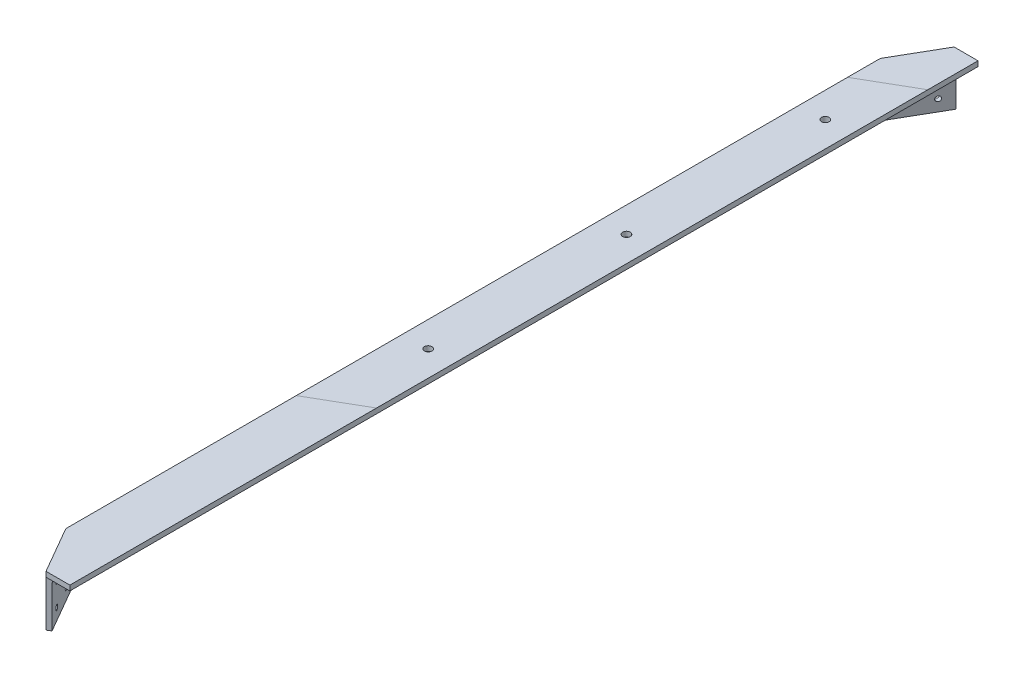
ISO-10303-21;
HEADER;
FILE_DESCRIPTION(('STEP AP214'),'2;1');
FILE_NAME('part.step','',(''),(''),'','','');
FILE_SCHEMA(('AUTOMOTIVE_DESIGN { 1 0 10303 214 1 1 1 1 }'));
ENDSEC;
DATA;
#1=APPLICATION_CONTEXT('core data for automotive mechanical design processes');
#2=APPLICATION_PROTOCOL_DEFINITION('international standard','automotive_design',2000,#1);
#3=PRODUCT_CONTEXT('',#1,'mechanical');
#4=PRODUCT('Part','Part','',(#3));
#5=PRODUCT_RELATED_PRODUCT_CATEGORY('part','',(#4));
#6=PRODUCT_DEFINITION_FORMATION('','',#4);
#7=PRODUCT_DEFINITION_CONTEXT('part definition',#1,'design');
#8=PRODUCT_DEFINITION('design','',#6,#7);
#9=PRODUCT_DEFINITION_SHAPE('','',#8);
#10=(LENGTH_UNIT() NAMED_UNIT(*) SI_UNIT(.MILLI.,.METRE.));
#11=(NAMED_UNIT(*) PLANE_ANGLE_UNIT() SI_UNIT($,.RADIAN.));
#12=(NAMED_UNIT(*) SI_UNIT($,.STERADIAN.) SOLID_ANGLE_UNIT());
#13=UNCERTAINTY_MEASURE_WITH_UNIT(LENGTH_MEASURE(1.E-05),#10,'distance_accuracy_value','');
#14=(GEOMETRIC_REPRESENTATION_CONTEXT(3) GLOBAL_UNCERTAINTY_ASSIGNED_CONTEXT((#13)) GLOBAL_UNIT_ASSIGNED_CONTEXT((#10,
#11,#12)) REPRESENTATION_CONTEXT('',''));
#15=CARTESIAN_POINT('',(0.,0.,0.));
#16=DIRECTION('',(0.,0.,1.));
#17=DIRECTION('',(1.,0.,0.));
#18=AXIS2_PLACEMENT_3D('',#15,#16,#17);
#19=CARTESIAN_POINT('',(-7.99999999999999,8.00000000000001,640.));
#20=DIRECTION('',(0.,-1.,0.));
#21=DIRECTION('',(1.,0.,0.));
#22=AXIS2_PLACEMENT_3D('',#19,#20,#21);
#23=PLANE('',#22);
#24=DIRECTION('',(0.866025403784436,0.,-0.500000000000004));
#25=VECTOR('',#24,1.);
#26=CARTESIAN_POINT('',(-164.815471676956,8.,368.387635642638));
#27=LINE('',#26,#25);
#28=CARTESIAN_POINT('',(-7.99999999999999,8.00000000000001,277.850180856848));
#29=VERTEX_POINT('',#28);
#30=CARTESIAN_POINT('',(72.,8.00000000000001,231.662159321678));
#31=VERTEX_POINT('',#30);
#32=EDGE_CURVE('E11',#29,#31,#27,.T.);
#33=ORIENTED_EDGE('',*,*,#32,.F.);
#34=DIRECTION('',(0.,0.,-1.));
#35=VECTOR('',#34,1.);
#36=CARTESIAN_POINT('',(-7.99999999999999,8.00000000000001,640.));
#37=LINE('',#36,#35);
#38=CARTESIAN_POINT('',(-7.99999999999999,8.00000000000001,637.320508075689));
#39=VERTEX_POINT('',#38);
#40=EDGE_CURVE('E288',#39,#29,#37,.T.);
#41=ORIENTED_EDGE('',*,*,#40,.F.);
#42=CARTESIAN_POINT('',(2.00000000000001,8.00000000000001,637.320508075689));
#43=DIRECTION('',(0.,-1.,0.));
#44=DIRECTION('',(1.,0.,0.));
#45=AXIS2_PLACEMENT_3D('',#42,#43,#44);
#46=CIRCLE('',#45,10.);
#47=CARTESIAN_POINT('',(-6.66025403784442,8.,642.320508075689));
#48=VERTEX_POINT('',#47);
#49=EDGE_CURVE('E311',#39,#48,#46,.F.);
#50=ORIENTED_EDGE('',*,*,#49,.T.);
#51=DIRECTION('',(0.499999999999995,0.,0.866025403784441));
#52=VECTOR('',#51,1.);
#53=CARTESIAN_POINT('',(-7.99999999999999,8.,640.));
#54=LINE('',#53,#52);
#55=CARTESIAN_POINT('',(34.4999999999996,8.,713.612159321677));
#56=VERTEX_POINT('',#55);
#57=EDGE_CURVE('E274',#48,#56,#54,.T.);
#58=ORIENTED_EDGE('',*,*,#57,.T.);
#59=DIRECTION('',(1.,0.,0.));
#60=VECTOR('',#59,1.);
#61=CARTESIAN_POINT('',(34.4999999999996,8.,713.612159321677));
#62=LINE('',#61,#60);
#63=CARTESIAN_POINT('',(72.,8.,713.612159321677));
#64=VERTEX_POINT('',#63);
#65=EDGE_CURVE('E276',#56,#64,#62,.T.);
#66=ORIENTED_EDGE('',*,*,#65,.T.);
#67=DIRECTION('',(0.,0.,-1.));
#68=VECTOR('',#67,1.);
#69=CARTESIAN_POINT('',(72.,8.00000000000001,640.));
#70=LINE('',#69,#68);
#71=EDGE_CURVE('E293',#64,#31,#70,.T.);
#72=ORIENTED_EDGE('',*,*,#71,.T.);
#73=EDGE_LOOP('',(#33,#41,#50,#58,#66,#72));
#74=FACE_BOUND('',#73,.T.);
#75=ADVANCED_FACE('F45',(#74),#23,.F.);
#76=DIRECTION('',(-0.86602540378444,0.,0.499999999999998));
#77=VECTOR('',#76,1.);
#78=CARTESIAN_POINT('',(-539.986635166949,7.99999999999998,-281.427881056769));
#79=LINE('',#78,#77);
#80=CARTESIAN_POINT('',(72.,8.00000000000001,-634.758529610858));
#81=VERTEX_POINT('',#80);
#82=CARTESIAN_POINT('',(-8.00000000000006,8.00000000000001,-588.570508075688));
#83=VERTEX_POINT('',#82);
#84=EDGE_CURVE('E54',#81,#83,#79,.T.);
#85=ORIENTED_EDGE('',*,*,#84,.F.);
#86=CARTESIAN_POINT('',(72.,8.,-713.612159321677));
#87=VERTEX_POINT('',#86);
#88=EDGE_CURVE('E291',#81,#87,#70,.T.);
#89=ORIENTED_EDGE('',*,*,#88,.T.);
#90=DIRECTION('',(1.,0.,0.));
#91=VECTOR('',#90,1.);
#92=CARTESIAN_POINT('',(34.4999999999996,8.,-713.612159321677));
#93=LINE('',#92,#91);
#94=CARTESIAN_POINT('',(34.4999999999996,8.,-713.612159321677));
#95=VERTEX_POINT('',#94);
#96=EDGE_CURVE('E221',#95,#87,#93,.T.);
#97=ORIENTED_EDGE('',*,*,#96,.F.);
#98=DIRECTION('',(0.499999999999995,0.,-0.866025403784441));
#99=VECTOR('',#98,1.);
#100=CARTESIAN_POINT('',(-7.99999999999999,8.,-640.));
#101=LINE('',#100,#99);
#102=CARTESIAN_POINT('',(-6.66025403784448,8.,-642.320508075689));
#103=VERTEX_POINT('',#102);
#104=EDGE_CURVE('E224',#103,#95,#101,.T.);
#105=ORIENTED_EDGE('',*,*,#104,.F.);
#106=CARTESIAN_POINT('',(2.00000000000001,8.00000000000001,-637.320508075689));
#107=DIRECTION('',(0.,-1.,0.));
#108=DIRECTION('',(1.,0.,0.));
#109=AXIS2_PLACEMENT_3D('',#106,#107,#108);
#110=CIRCLE('',#109,10.);
#111=CARTESIAN_POINT('',(-7.99999999999999,8.00000000000001,-637.320508075689));
#112=VERTEX_POINT('',#111);
#113=EDGE_CURVE('E348',#103,#112,#110,.F.);
#114=ORIENTED_EDGE('',*,*,#113,.T.);
#115=EDGE_CURVE('E287',#83,#112,#37,.T.);
#116=ORIENTED_EDGE('',*,*,#115,.F.);
#117=EDGE_LOOP('',(#85,#89,#97,#105,#114,#116));
#118=FACE_BOUND('',#117,.T.);
#119=ADVANCED_FACE('F386',(#118),#23,.F.);
#120=CARTESIAN_POINT('',(72.,0.,640.));
#121=DIRECTION('',(0.,1.,0.));
#122=DIRECTION('',(-1.,0.,0.));
#123=AXIS2_PLACEMENT_3D('',#120,#121,#122);
#124=PLANE('',#123);
#125=CARTESIAN_POINT('',(32.,0.,-513.612159321678));
#126=DIRECTION('',(0.,1.,0.));
#127=DIRECTION('',(-1.,0.,0.));
#128=AXIS2_PLACEMENT_3D('',#125,#126,#127);
#129=CIRCLE('',#128,6.);
#130=CARTESIAN_POINT('',(26.,0.,-513.612159321678));
#131=VERTEX_POINT('',#130);
#132=EDGE_CURVE('E378',#131,#131,#129,.T.);
#133=ORIENTED_EDGE('',*,*,#132,.T.);
#134=EDGE_LOOP('',(#133));
#135=FACE_BOUND('',#134,.T.);
#136=CARTESIAN_POINT('',(32.,0.,-201.112159321678));
#137=DIRECTION('',(0.,1.,0.));
#138=DIRECTION('',(-1.,0.,0.));
#139=AXIS2_PLACEMENT_3D('',#136,#137,#138);
#140=CIRCLE('',#139,6.);
#141=CARTESIAN_POINT('',(26.,0.,-201.112159321678));
#142=VERTEX_POINT('',#141);
#143=EDGE_CURVE('E509',#142,#142,#140,.T.);
#144=ORIENTED_EDGE('',*,*,#143,.T.);
#145=EDGE_LOOP('',(#144));
#146=FACE_BOUND('',#145,.T.);
#147=CARTESIAN_POINT('',(32.,0.,110.512159321678));
#148=DIRECTION('',(0.,1.,0.));
#149=DIRECTION('',(-1.,0.,0.));
#150=AXIS2_PLACEMENT_3D('',#147,#148,#149);
#151=CIRCLE('',#150,6.);
#152=CARTESIAN_POINT('',(26.,0.,110.512159321678));
#153=VERTEX_POINT('',#152);
#154=EDGE_CURVE('E510',#153,#153,#151,.T.);
#155=ORIENTED_EDGE('',*,*,#154,.T.);
#156=EDGE_LOOP('',(#155));
#157=FACE_BOUND('',#156,.T.);
#158=DIRECTION('',(0.,0.,-1.));
#159=VECTOR('',#158,1.);
#160=CARTESIAN_POINT('',(8.00000000000001,0.,0.));
#161=LINE('',#160,#159);
#162=CARTESIAN_POINT('',(8.,0.,637.320508075689));
#163=VERTEX_POINT('',#162);
#164=CARTESIAN_POINT('',(8.00000000000001,0.,0.));
#165=VERTEX_POINT('',#164);
#166=EDGE_CURVE('E324',#163,#165,#161,.T.);
#167=ORIENTED_EDGE('',*,*,#166,.T.);
#168=DIRECTION('',(0.,0.,1.));
#169=VECTOR('',#168,1.);
#170=CARTESIAN_POINT('',(8.,0.,-637.320508075689));
#171=LINE('',#170,#169);
#172=CARTESIAN_POINT('',(8.,0.,-637.320508075689));
#173=VERTEX_POINT('',#172);
#174=EDGE_CURVE('E366',#165,#173,#171,.F.);
#175=ORIENTED_EDGE('',*,*,#174,.T.);
#176=CARTESIAN_POINT('',(10.,0.,-637.320508075689));
#177=DIRECTION('',(0.,1.,0.));
#178=DIRECTION('',(-1.,0.,0.));
#179=AXIS2_PLACEMENT_3D('',#176,#177,#178);
#180=CIRCLE('',#179,2.);
#181=CARTESIAN_POINT('',(8.26794919243096,0.,-638.320508075689));
#182=VERTEX_POINT('',#181);
#183=EDGE_CURVE('E364',#173,#182,#180,.F.);
#184=ORIENTED_EDGE('',*,*,#183,.T.);
#185=DIRECTION('',(0.499999999999996,0.,-0.866025403784441));
#186=VECTOR('',#185,1.);
#187=CARTESIAN_POINT('',(-529.328055191762,0.,292.823085463766));
#188=LINE('',#187,#186);
#189=CARTESIAN_POINT('',(47.4282032302751,0.,-706.14805770654));
#190=VERTEX_POINT('',#189);
#191=EDGE_CURVE('E361',#182,#190,#188,.T.);
#192=ORIENTED_EDGE('',*,*,#191,.T.);
#193=DIRECTION('',(-0.866025403784439,0.,-0.5));
#194=VECTOR('',#193,1.);
#195=CARTESIAN_POINT('',(34.4999999999996,0.,-713.612159321677));
#196=LINE('',#195,#194);
#197=CARTESIAN_POINT('',(34.4999999999996,0.,-713.612159321677));
#198=VERTEX_POINT('',#197);
#199=EDGE_CURVE('E208',#190,#198,#196,.T.);
#200=ORIENTED_EDGE('',*,*,#199,.T.);
#201=DIRECTION('',(1.,0.,0.));
#202=VECTOR('',#201,1.);
#203=CARTESIAN_POINT('',(34.4999999999996,0.,-713.612159321677));
#204=LINE('',#203,#202);
#205=CARTESIAN_POINT('',(72.,0.,-713.612159321677));
#206=VERTEX_POINT('',#205);
#207=EDGE_CURVE('E198',#198,#206,#204,.T.);
#208=ORIENTED_EDGE('',*,*,#207,.T.);
#209=DIRECTION('',(0.,0.,-1.));
#210=VECTOR('',#209,1.);
#211=CARTESIAN_POINT('',(72.,0.,640.));
#212=LINE('',#211,#210);
#213=CARTESIAN_POINT('',(72.,0.,713.612159321677));
#214=VERTEX_POINT('',#213);
#215=EDGE_CURVE('E296',#214,#206,#212,.T.);
#216=ORIENTED_EDGE('',*,*,#215,.F.);
#217=DIRECTION('',(1.,0.,0.));
#218=VECTOR('',#217,1.);
#219=CARTESIAN_POINT('',(34.4999999999996,0.,713.612159321677));
#220=LINE('',#219,#218);
#221=CARTESIAN_POINT('',(34.4999999999996,0.,713.612159321677));
#222=VERTEX_POINT('',#221);
#223=EDGE_CURVE('E273',#222,#214,#220,.T.);
#224=ORIENTED_EDGE('',*,*,#223,.F.);
#225=DIRECTION('',(-0.866025403784439,0.,0.5));
#226=VECTOR('',#225,1.);
#227=CARTESIAN_POINT('',(34.4999999999996,0.,713.612159321677));
#228=LINE('',#227,#226);
#229=CARTESIAN_POINT('',(47.4282032302752,0.,706.14805770654));
#230=VERTEX_POINT('',#229);
#231=EDGE_CURVE('E258',#230,#222,#228,.T.);
#232=ORIENTED_EDGE('',*,*,#231,.F.);
#233=DIRECTION('',(0.499999999999996,0.,0.866025403784441));
#234=VECTOR('',#233,1.);
#235=CARTESIAN_POINT('',(8.26794919243111,0.,638.320508075689));
#236=LINE('',#235,#234);
#237=CARTESIAN_POINT('',(8.26794919243111,0.,638.320508075689));
#238=VERTEX_POINT('',#237);
#239=EDGE_CURVE('E320',#230,#238,#236,.F.);
#240=ORIENTED_EDGE('',*,*,#239,.T.);
#241=CARTESIAN_POINT('',(10.,0.,637.320508075689));
#242=DIRECTION('',(0.,1.,0.));
#243=DIRECTION('',(-1.,0.,0.));
#244=AXIS2_PLACEMENT_3D('',#241,#242,#243);
#245=CIRCLE('',#244,2.);
#246=EDGE_CURVE('E322',#238,#163,#245,.F.);
#247=ORIENTED_EDGE('',*,*,#246,.T.);
#248=EDGE_LOOP('',(#167,#175,#184,#192,#200,#208,#216,#224,#232,#240,#247));
#249=FACE_BOUND('',#248,.T.);
#250=ADVANCED_FACE('F423',(#135,#146,#157,#249),#124,.F.);
#251=CARTESIAN_POINT('',(-8.,-72.,640.));
#252=DIRECTION('',(1.,0.,0.));
#253=DIRECTION('',(0.,1.,0.));
#254=AXIS2_PLACEMENT_3D('',#251,#252,#253);
#255=PLANE('',#254);
#256=ORIENTED_EDGE('',*,*,#40,.T.);
#257=EDGE_CURVE('E292',#29,#83,#37,.T.);
#258=ORIENTED_EDGE('',*,*,#257,.T.);
#259=ORIENTED_EDGE('',*,*,#115,.T.);
#260=DIRECTION('',(0.,-1.,0.));
#261=VECTOR('',#260,1.);
#262=CARTESIAN_POINT('',(-8.,-72.,-637.320508075689));
#263=LINE('',#262,#261);
#264=CARTESIAN_POINT('',(-8.,-72.,-637.320508075689));
#265=VERTEX_POINT('',#264);
#266=EDGE_CURVE('E338',#112,#265,#263,.T.);
#267=ORIENTED_EDGE('',*,*,#266,.T.);
#268=DIRECTION('',(0.,0.,-1.));
#269=VECTOR('',#268,1.);
#270=CARTESIAN_POINT('',(-8.,-72.,640.));
#271=LINE('',#270,#269);
#272=CARTESIAN_POINT('',(-8.,-72.,637.320508075689));
#273=VERTEX_POINT('',#272);
#274=EDGE_CURVE('E302',#273,#265,#271,.T.);
#275=ORIENTED_EDGE('',*,*,#274,.F.);
#276=DIRECTION('',(0.,-1.,0.));
#277=VECTOR('',#276,1.);
#278=CARTESIAN_POINT('',(-8.,-72.,637.320508075689));
#279=LINE('',#278,#277);
#280=EDGE_CURVE('E309',#273,#39,#279,.F.);
#281=ORIENTED_EDGE('',*,*,#280,.T.);
#282=EDGE_LOOP('',(#256,#258,#259,#267,#275,#281));
#283=FACE_BOUND('',#282,.T.);
#284=ADVANCED_FACE('F391',(#283),#255,.F.);
#285=CARTESIAN_POINT('',(0.,-72.,640.));
#286=DIRECTION('',(0.,1.,0.));
#287=DIRECTION('',(0.,0.,1.));
#288=AXIS2_PLACEMENT_3D('',#285,#286,#287);
#289=PLANE('',#288);
#290=ORIENTED_EDGE('',*,*,#274,.T.);
#291=CARTESIAN_POINT('',(2.,-72.,-637.320508075689));
#292=DIRECTION('',(0.,1.,0.));
#293=DIRECTION('',(0.,0.,1.));
#294=AXIS2_PLACEMENT_3D('',#291,#292,#293);
#295=CIRCLE('',#294,10.);
#296=CARTESIAN_POINT('',(-6.66025403784449,-72.,-642.320508075689));
#297=VERTEX_POINT('',#296);
#298=EDGE_CURVE('E207',#265,#297,#295,.F.);
#299=ORIENTED_EDGE('',*,*,#298,.T.);
#300=DIRECTION('',(-0.499999999999996,0.,0.866025403784441));
#301=VECTOR('',#300,1.);
#302=CARTESIAN_POINT('',(-8.,-72.,-640.));
#303=LINE('',#302,#301);
#304=CARTESIAN_POINT('',(34.4999999999996,-72.,-713.612159321677));
#305=VERTEX_POINT('',#304);
#306=EDGE_CURVE('E191',#305,#297,#303,.T.);
#307=ORIENTED_EDGE('',*,*,#306,.F.);
#308=DIRECTION('',(-0.866025403784439,0.,-0.5));
#309=VECTOR('',#308,1.);
#310=CARTESIAN_POINT('',(34.4999999999996,-72.,-713.612159321677));
#311=LINE('',#310,#309);
#312=CARTESIAN_POINT('',(40.4999999999997,-72.,-710.14805770654));
#313=VERTEX_POINT('',#312);
#314=EDGE_CURVE('E206',#313,#305,#311,.T.);
#315=ORIENTED_EDGE('',*,*,#314,.F.);
#316=DIRECTION('',(0.499999999999996,0.,-0.866025403784441));
#317=VECTOR('',#316,1.);
#318=CARTESIAN_POINT('',(40.4999999999997,-72.,-710.14805770654));
#319=LINE('',#318,#317);
#320=CARTESIAN_POINT('',(1.33974596215551,-72.,-642.320508075689));
#321=VERTEX_POINT('',#320);
#322=EDGE_CURVE('E213',#321,#313,#319,.T.);
#323=ORIENTED_EDGE('',*,*,#322,.F.);
#324=CARTESIAN_POINT('',(10.,-72.,-637.320508075689));
#325=DIRECTION('',(0.,1.,0.));
#326=DIRECTION('',(0.,0.,1.));
#327=AXIS2_PLACEMENT_3D('',#324,#325,#326);
#328=CIRCLE('',#327,10.);
#329=CARTESIAN_POINT('',(0.,-72.,-637.320508075689));
#330=VERTEX_POINT('',#329);
#331=EDGE_CURVE('E356',#321,#330,#328,.T.);
#332=ORIENTED_EDGE('',*,*,#331,.T.);
#333=DIRECTION('',(0.,0.,-1.));
#334=VECTOR('',#333,1.);
#335=CARTESIAN_POINT('',(0.,-72.,640.));
#336=LINE('',#335,#334);
#337=CARTESIAN_POINT('',(0.,-72.,637.320508075689));
#338=VERTEX_POINT('',#337);
#339=EDGE_CURVE('E299',#338,#330,#336,.T.);
#340=ORIENTED_EDGE('',*,*,#339,.F.);
#341=CARTESIAN_POINT('',(10.,-72.,637.320508075689));
#342=DIRECTION('',(0.,1.,0.));
#343=DIRECTION('',(0.,0.,1.));
#344=AXIS2_PLACEMENT_3D('',#341,#342,#343);
#345=CIRCLE('',#344,10.);
#346=CARTESIAN_POINT('',(1.33974596215557,-72.,642.320508075689));
#347=VERTEX_POINT('',#346);
#348=EDGE_CURVE('E318',#338,#347,#345,.T.);
#349=ORIENTED_EDGE('',*,*,#348,.T.);
#350=DIRECTION('',(0.499999999999996,0.,0.866025403784441));
#351=VECTOR('',#350,1.);
#352=CARTESIAN_POINT('',(40.4999999999997,-72.,710.14805770654));
#353=LINE('',#352,#351);
#354=CARTESIAN_POINT('',(40.4999999999997,-72.,710.14805770654));
#355=VERTEX_POINT('',#354);
#356=EDGE_CURVE('E259',#347,#355,#353,.T.);
#357=ORIENTED_EDGE('',*,*,#356,.T.);
#358=DIRECTION('',(-0.866025403784439,0.,0.5));
#359=VECTOR('',#358,1.);
#360=CARTESIAN_POINT('',(34.4999999999996,-72.,713.612159321677));
#361=LINE('',#360,#359);
#362=CARTESIAN_POINT('',(34.4999999999996,-72.,713.612159321677));
#363=VERTEX_POINT('',#362);
#364=EDGE_CURVE('E261',#355,#363,#361,.T.);
#365=ORIENTED_EDGE('',*,*,#364,.T.);
#366=DIRECTION('',(-0.499999999999996,0.,-0.866025403784441));
#367=VECTOR('',#366,1.);
#368=CARTESIAN_POINT('',(-8.,-72.,640.));
#369=LINE('',#368,#367);
#370=CARTESIAN_POINT('',(-6.66025403784442,-72.,642.320508075689));
#371=VERTEX_POINT('',#370);
#372=EDGE_CURVE('E263',#363,#371,#369,.T.);
#373=ORIENTED_EDGE('',*,*,#372,.T.);
#374=CARTESIAN_POINT('',(2.,-72.,637.320508075689));
#375=DIRECTION('',(0.,1.,0.));
#376=DIRECTION('',(0.,0.,1.));
#377=AXIS2_PLACEMENT_3D('',#374,#375,#376);
#378=CIRCLE('',#377,10.);
#379=EDGE_CURVE('E307',#371,#273,#378,.F.);
#380=ORIENTED_EDGE('',*,*,#379,.T.);
#381=EDGE_LOOP('',(#290,#299,#307,#315,#323,#332,#340,#349,#357,#365,#373,#380));
#382=FACE_BOUND('',#381,.T.);
#383=ADVANCED_FACE('F204',(#382),#289,.F.);
#384=CARTESIAN_POINT('',(0.,0.,640.));
#385=DIRECTION('',(-1.,0.,0.));
#386=DIRECTION('',(0.,-1.,0.));
#387=AXIS2_PLACEMENT_3D('',#384,#385,#386);
#388=PLANE('',#387);
#389=DIRECTION('',(0.,1.,0.));
#390=VECTOR('',#389,1.);
#391=CARTESIAN_POINT('',(0.,0.,-637.320508075689));
#392=LINE('',#391,#390);
#393=CARTESIAN_POINT('',(0.,-8.,-637.320508075689));
#394=VERTEX_POINT('',#393);
#395=EDGE_CURVE('E351',#330,#394,#392,.T.);
#396=ORIENTED_EDGE('',*,*,#395,.T.);
#397=DIRECTION('',(0.,0.,1.));
#398=VECTOR('',#397,1.);
#399=CARTESIAN_POINT('',(0.,-8.,0.));
#400=LINE('',#399,#398);
#401=CARTESIAN_POINT('',(0.,-8.,0.));
#402=VERTEX_POINT('',#401);
#403=EDGE_CURVE('E358',#394,#402,#400,.T.);
#404=ORIENTED_EDGE('',*,*,#403,.T.);
#405=DIRECTION('',(0.,0.,-1.));
#406=VECTOR('',#405,1.);
#407=CARTESIAN_POINT('',(0.,-8.,637.320508075689));
#408=LINE('',#407,#406);
#409=CARTESIAN_POINT('',(0.,-8.00000000000001,637.320508075689));
#410=VERTEX_POINT('',#409);
#411=EDGE_CURVE('E327',#402,#410,#408,.F.);
#412=ORIENTED_EDGE('',*,*,#411,.T.);
#413=DIRECTION('',(0.,1.,0.));
#414=VECTOR('',#413,1.);
#415=CARTESIAN_POINT('',(0.,-72.,637.320508075689));
#416=LINE('',#415,#414);
#417=EDGE_CURVE('E316',#410,#338,#416,.F.);
#418=ORIENTED_EDGE('',*,*,#417,.T.);
#419=ORIENTED_EDGE('',*,*,#339,.T.);
#420=EDGE_LOOP('',(#396,#404,#412,#418,#419));
#421=FACE_BOUND('',#420,.T.);
#422=ADVANCED_FACE('F443',(#421),#388,.F.);
#423=CARTESIAN_POINT('',(72.,8.00000000000001,640.));
#424=DIRECTION('',(-1.,0.,0.));
#425=DIRECTION('',(0.,0.,1.));
#426=AXIS2_PLACEMENT_3D('',#423,#424,#425);
#427=PLANE('',#426);
#428=ORIENTED_EDGE('',*,*,#215,.T.);
#429=DIRECTION('',(0.,-1.,0.));
#430=VECTOR('',#429,1.);
#431=CARTESIAN_POINT('',(72.,8.,-713.612159321677));
#432=LINE('',#431,#430);
#433=EDGE_CURVE('E229',#87,#206,#432,.T.);
#434=ORIENTED_EDGE('',*,*,#433,.F.);
#435=ORIENTED_EDGE('',*,*,#88,.F.);
#436=EDGE_CURVE('E297',#31,#81,#70,.T.);
#437=ORIENTED_EDGE('',*,*,#436,.F.);
#438=ORIENTED_EDGE('',*,*,#71,.F.);
#439=DIRECTION('',(0.,-1.,0.));
#440=VECTOR('',#439,1.);
#441=CARTESIAN_POINT('',(72.,8.,713.612159321677));
#442=LINE('',#441,#440);
#443=EDGE_CURVE('E279',#64,#214,#442,.T.);
#444=ORIENTED_EDGE('',*,*,#443,.T.);
#445=EDGE_LOOP('',(#428,#434,#435,#437,#438,#444));
#446=FACE_BOUND('',#445,.T.);
#447=ADVANCED_FACE('F417',(#446),#427,.F.);
#448=CARTESIAN_POINT('',(32.,8.00000000000001,-513.612159321678));
#449=DIRECTION('',(0.,1.,0.));
#450=DIRECTION('',(-1.,0.,0.));
#451=AXIS2_PLACEMENT_3D('',#448,#449,#450);
#452=CIRCLE('',#451,6.);
#453=CARTESIAN_POINT('',(26.,8.00000000000001,-513.612159321678));
#454=VERTEX_POINT('',#453);
#455=EDGE_CURVE('E500',#454,#454,#452,.T.);
#456=ORIENTED_EDGE('',*,*,#455,.F.);
#457=EDGE_LOOP('',(#456));
#458=FACE_BOUND('',#457,.T.);
#459=CARTESIAN_POINT('',(32.,8.00000000000001,-201.112159321678));
#460=DIRECTION('',(0.,1.,0.));
#461=DIRECTION('',(-1.,0.,0.));
#462=AXIS2_PLACEMENT_3D('',#459,#460,#461);
#463=CIRCLE('',#462,6.);
#464=CARTESIAN_POINT('',(26.,8.00000000000001,-201.112159321678));
#465=VERTEX_POINT('',#464);
#466=EDGE_CURVE('E504',#465,#465,#463,.T.);
#467=ORIENTED_EDGE('',*,*,#466,.F.);
#468=EDGE_LOOP('',(#467));
#469=FACE_BOUND('',#468,.T.);
#470=CARTESIAN_POINT('',(32.,8.00000000000001,110.512159321678));
#471=DIRECTION('',(0.,1.,0.));
#472=DIRECTION('',(-1.,0.,0.));
#473=AXIS2_PLACEMENT_3D('',#470,#471,#472);
#474=CIRCLE('',#473,6.);
#475=CARTESIAN_POINT('',(26.,8.00000000000001,110.512159321678));
#476=VERTEX_POINT('',#475);
#477=EDGE_CURVE('E507',#476,#476,#474,.T.);
#478=ORIENTED_EDGE('',*,*,#477,.F.);
#479=EDGE_LOOP('',(#478));
#480=FACE_BOUND('',#479,.T.);
#481=ORIENTED_EDGE('',*,*,#257,.F.);
#482=ORIENTED_EDGE('',*,*,#32,.T.);
#483=ORIENTED_EDGE('',*,*,#436,.T.);
#484=ORIENTED_EDGE('',*,*,#84,.T.);
#485=EDGE_LOOP('',(#481,#482,#483,#484));
#486=FACE_BOUND('',#485,.T.);
#487=ADVANCED_FACE('F384',(#458,#469,#480,#486),#23,.F.);
#488=CARTESIAN_POINT('',(-7.99999999999999,8.,640.));
#489=DIRECTION('',(0.866025403784441,0.,-0.499999999999995));
#490=DIRECTION('',(-0.499999999999995,0.,-0.866025403784441));
#491=AXIS2_PLACEMENT_3D('',#488,#489,#490);
#492=PLANE('',#491);
#493=CARTESIAN_POINT('',(24.3749999999998,-54.,696.075144895043));
#494=DIRECTION('',(0.866025403784441,0.,-0.499999999999995));
#495=DIRECTION('',(-0.499999999999995,0.,-0.866025403784441));
#496=AXIS2_PLACEMENT_3D('',#493,#494,#495);
#497=CIRCLE('',#496,4.00000000000006);
#498=CARTESIAN_POINT('',(22.3749999999998,-54.,692.611043279905));
#499=VERTEX_POINT('',#498);
#500=EDGE_CURVE('E255',#499,#499,#497,.T.);
#501=ORIENTED_EDGE('',*,*,#500,.T.);
#502=EDGE_LOOP('',(#501));
#503=FACE_BOUND('',#502,.T.);
#504=CARTESIAN_POINT('',(4.12499999999999,-54.,661.001116041773));
#505=DIRECTION('',(0.866025403784441,0.,-0.499999999999995));
#506=DIRECTION('',(-0.499999999999995,0.,-0.866025403784441));
#507=AXIS2_PLACEMENT_3D('',#504,#505,#506);
#508=CIRCLE('',#507,3.99999999999997);
#509=CARTESIAN_POINT('',(2.12500000000002,-54.,657.537014426635));
#510=VERTEX_POINT('',#509);
#511=EDGE_CURVE('E252',#510,#510,#508,.T.);
#512=ORIENTED_EDGE('',*,*,#511,.T.);
#513=EDGE_LOOP('',(#512));
#514=FACE_BOUND('',#513,.T.);
#515=CARTESIAN_POINT('',(4.12499999999999,-18.,661.001116041773));
#516=DIRECTION('',(0.866025403784441,0.,-0.499999999999995));
#517=DIRECTION('',(-0.499999999999995,0.,-0.866025403784441));
#518=AXIS2_PLACEMENT_3D('',#515,#516,#517);
#519=CIRCLE('',#518,3.99999999999997);
#520=CARTESIAN_POINT('',(2.12500000000002,-18.,657.537014426635));
#521=VERTEX_POINT('',#520);
#522=EDGE_CURVE('E249',#521,#521,#519,.T.);
#523=ORIENTED_EDGE('',*,*,#522,.T.);
#524=EDGE_LOOP('',(#523));
#525=FACE_BOUND('',#524,.T.);
#526=CARTESIAN_POINT('',(24.3749999999998,-18.,696.075144895043));
#527=DIRECTION('',(0.866025403784441,0.,-0.499999999999995));
#528=DIRECTION('',(-0.499999999999995,0.,-0.866025403784441));
#529=AXIS2_PLACEMENT_3D('',#526,#527,#528);
#530=CIRCLE('',#529,4.00000000000006);
#531=CARTESIAN_POINT('',(22.3749999999998,-18.,692.611043279905));
#532=VERTEX_POINT('',#531);
#533=EDGE_CURVE('E246',#532,#532,#530,.T.);
#534=ORIENTED_EDGE('',*,*,#533,.T.);
#535=EDGE_LOOP('',(#534));
#536=FACE_BOUND('',#535,.T.);
#537=ORIENTED_EDGE('',*,*,#57,.F.);
#538=DIRECTION('',(0.,-1.,0.));
#539=VECTOR('',#538,1.);
#540=CARTESIAN_POINT('',(-6.66025403784442,8.,642.320508075689));
#541=LINE('',#540,#539);
#542=EDGE_CURVE('E304',#48,#371,#541,.T.);
#543=ORIENTED_EDGE('',*,*,#542,.T.);
#544=ORIENTED_EDGE('',*,*,#372,.F.);
#545=DIRECTION('',(0.,1.,0.));
#546=VECTOR('',#545,1.);
#547=CARTESIAN_POINT('',(34.4999999999996,-72.,713.612159321677));
#548=LINE('',#547,#546);
#549=EDGE_CURVE('E266',#363,#222,#548,.T.);
#550=ORIENTED_EDGE('',*,*,#549,.T.);
#551=DIRECTION('',(0.,-1.,0.));
#552=VECTOR('',#551,1.);
#553=CARTESIAN_POINT('',(34.4999999999996,8.,713.612159321677));
#554=LINE('',#553,#552);
#555=EDGE_CURVE('E284',#56,#222,#554,.T.);
#556=ORIENTED_EDGE('',*,*,#555,.F.);
#557=EDGE_LOOP('',(#537,#543,#544,#550,#556));
#558=FACE_BOUND('',#557,.T.);
#559=ADVANCED_FACE('F403',(#503,#514,#525,#536,#558),#492,.F.);
#560=CARTESIAN_POINT('',(34.4999999999996,8.,713.612159321677));
#561=DIRECTION('',(0.,0.,-1.));
#562=DIRECTION('',(-1.,0.,0.));
#563=AXIS2_PLACEMENT_3D('',#560,#561,#562);
#564=PLANE('',#563);
#565=ORIENTED_EDGE('',*,*,#223,.T.);
#566=ORIENTED_EDGE('',*,*,#443,.F.);
#567=ORIENTED_EDGE('',*,*,#65,.F.);
#568=ORIENTED_EDGE('',*,*,#555,.T.);
#569=EDGE_LOOP('',(#565,#566,#567,#568));
#570=FACE_BOUND('',#569,.T.);
#571=ADVANCED_FACE('F415',(#570),#564,.F.);
#572=CARTESIAN_POINT('',(40.4999999999997,-72.,710.14805770654));
#573=DIRECTION('',(-0.866025403784441,0.,0.499999999999996));
#574=DIRECTION('',(0.499999999999996,0.,0.866025403784441));
#575=AXIS2_PLACEMENT_3D('',#572,#573,#574);
#576=PLANE('',#575);
#577=CARTESIAN_POINT('',(30.3749999999997,-54.,692.611043279905));
#578=DIRECTION('',(0.866025403784441,0.,-0.499999999999996));
#579=DIRECTION('',(0.499999999999996,0.,0.866025403784441));
#580=AXIS2_PLACEMENT_3D('',#577,#578,#579);
#581=CIRCLE('',#580,4.00000000000006);
#582=CARTESIAN_POINT('',(32.3749999999997,-54.,696.075144895043));
#583=VERTEX_POINT('',#582);
#584=EDGE_CURVE('E240',#583,#583,#581,.T.);
#585=ORIENTED_EDGE('',*,*,#584,.F.);
#586=EDGE_LOOP('',(#585));
#587=FACE_BOUND('',#586,.T.);
#588=CARTESIAN_POINT('',(10.1249999999999,-54.,657.537014426635));
#589=DIRECTION('',(0.866025403784441,0.,-0.499999999999996));
#590=DIRECTION('',(-0.499999999999996,0.,-0.866025403784441));
#591=AXIS2_PLACEMENT_3D('',#588,#589,#590);
#592=CIRCLE('',#591,3.99999999999997);
#593=CARTESIAN_POINT('',(8.12499999999997,-54.,654.072912811497));
#594=VERTEX_POINT('',#593);
#595=EDGE_CURVE('E237',#594,#594,#592,.T.);
#596=ORIENTED_EDGE('',*,*,#595,.F.);
#597=EDGE_LOOP('',(#596));
#598=FACE_BOUND('',#597,.T.);
#599=CARTESIAN_POINT('',(10.1249999999999,-18.,657.537014426635));
#600=DIRECTION('',(0.866025403784441,0.,-0.499999999999996));
#601=DIRECTION('',(0.499999999999996,0.,0.866025403784441));
#602=AXIS2_PLACEMENT_3D('',#599,#600,#601);
#603=CIRCLE('',#602,3.99999999999997);
#604=CARTESIAN_POINT('',(12.1249999999999,-18.,661.001116041773));
#605=VERTEX_POINT('',#604);
#606=EDGE_CURVE('E233',#605,#605,#603,.T.);
#607=ORIENTED_EDGE('',*,*,#606,.F.);
#608=EDGE_LOOP('',(#607));
#609=FACE_BOUND('',#608,.T.);
#610=CARTESIAN_POINT('',(30.3749999999997,-18.,692.611043279905));
#611=DIRECTION('',(0.866025403784441,0.,-0.499999999999996));
#612=DIRECTION('',(-0.499999999999996,0.,-0.866025403784441));
#613=AXIS2_PLACEMENT_3D('',#610,#611,#612);
#614=CIRCLE('',#613,4.00000000000006);
#615=CARTESIAN_POINT('',(28.3749999999997,-18.,689.146941664767));
#616=VERTEX_POINT('',#615);
#617=EDGE_CURVE('E236',#616,#616,#614,.T.);
#618=ORIENTED_EDGE('',*,*,#617,.F.);
#619=EDGE_LOOP('',(#618));
#620=FACE_BOUND('',#619,.T.);
#621=DIRECTION('',(0.,1.,0.));
#622=VECTOR('',#621,1.);
#623=CARTESIAN_POINT('',(1.33974596215556,0.,642.320508075689));
#624=LINE('',#623,#622);
#625=CARTESIAN_POINT('',(1.33974596215556,-8.,642.320508075689));
#626=VERTEX_POINT('',#625);
#627=EDGE_CURVE('E313',#347,#626,#624,.T.);
#628=ORIENTED_EDGE('',*,*,#627,.T.);
#629=DIRECTION('',(0.499999999999996,0.,0.866025403784441));
#630=VECTOR('',#629,1.);
#631=CARTESIAN_POINT('',(40.4999999999996,-7.99999999999999,710.14805770654));
#632=LINE('',#631,#630);
#633=CARTESIAN_POINT('',(40.4999999999997,-7.99999999999999,710.14805770654));
#634=VERTEX_POINT('',#633);
#635=EDGE_CURVE('E331',#626,#634,#632,.T.);
#636=ORIENTED_EDGE('',*,*,#635,.T.);
#637=DIRECTION('',(0.,1.,0.));
#638=VECTOR('',#637,1.);
#639=CARTESIAN_POINT('',(40.4999999999997,-72.,710.14805770654));
#640=LINE('',#639,#638);
#641=EDGE_CURVE('E270',#355,#634,#640,.T.);
#642=ORIENTED_EDGE('',*,*,#641,.F.);
#643=ORIENTED_EDGE('',*,*,#356,.F.);
#644=EDGE_LOOP('',(#628,#636,#642,#643));
#645=FACE_BOUND('',#644,.T.);
#646=ADVANCED_FACE('F454',(#587,#598,#609,#620,#645),#576,.F.);
#647=CARTESIAN_POINT('',(34.4999999999996,-72.,713.612159321677));
#648=DIRECTION('',(-0.5,0.,-0.866025403784439));
#649=DIRECTION('',(-0.866025403784439,0.,0.5));
#650=AXIS2_PLACEMENT_3D('',#647,#648,#649);
#651=PLANE('',#650);
#652=ORIENTED_EDGE('',*,*,#231,.T.);
#653=ORIENTED_EDGE('',*,*,#549,.F.);
#654=ORIENTED_EDGE('',*,*,#364,.F.);
#655=ORIENTED_EDGE('',*,*,#641,.T.);
#656=CARTESIAN_POINT('',(47.4282032302752,-7.99999999999999,706.14805770654));
#657=DIRECTION('',(-0.5,0.,-0.866025403784439));
#658=DIRECTION('',(-0.866025403784439,0.,0.5));
#659=AXIS2_PLACEMENT_3D('',#656,#657,#658);
#660=CIRCLE('',#659,8.);
#661=EDGE_CURVE('E335',#634,#230,#660,.T.);
#662=ORIENTED_EDGE('',*,*,#661,.T.);
#663=EDGE_LOOP('',(#652,#653,#654,#655,#662));
#664=FACE_BOUND('',#663,.T.);
#665=ADVANCED_FACE('F410',(#664),#651,.F.);
#666=CARTESIAN_POINT('',(23.4467967697242,-18.,696.611043279905));
#667=DIRECTION('',(0.866025403784441,0.,-0.499999999999996));
#668=DIRECTION('',(-0.499999999999996,0.,-0.866025403784441));
#669=AXIS2_PLACEMENT_3D('',#666,#667,#668);
#670=CYLINDRICAL_SURFACE('',#669,4.00000000000006);
#671=ORIENTED_EDGE('',*,*,#617,.T.);
#672=EDGE_LOOP('',(#671));
#673=FACE_BOUND('',#672,.T.);
#674=ORIENTED_EDGE('',*,*,#533,.F.);
#675=EDGE_LOOP('',(#674));
#676=FACE_BOUND('',#675,.T.);
#677=ADVANCED_FACE('F580',(#673,#676),#670,.F.);
#678=CARTESIAN_POINT('',(3.19679676972441,-18.,661.537014426635));
#679=DIRECTION('',(0.866025403784441,0.,-0.499999999999996));
#680=DIRECTION('',(-0.499999999999996,0.,-0.866025403784441));
#681=AXIS2_PLACEMENT_3D('',#678,#679,#680);
#682=CYLINDRICAL_SURFACE('',#681,3.99999999999997);
#683=ORIENTED_EDGE('',*,*,#606,.T.);
#684=EDGE_LOOP('',(#683));
#685=FACE_BOUND('',#684,.T.);
#686=ORIENTED_EDGE('',*,*,#522,.F.);
#687=EDGE_LOOP('',(#686));
#688=FACE_BOUND('',#687,.T.);
#689=ADVANCED_FACE('F576',(#685,#688),#682,.F.);
#690=CARTESIAN_POINT('',(3.19679676972441,-54.,661.537014426635));
#691=DIRECTION('',(0.866025403784441,0.,-0.499999999999996));
#692=DIRECTION('',(-0.499999999999996,0.,-0.866025403784441));
#693=AXIS2_PLACEMENT_3D('',#690,#691,#692);
#694=CYLINDRICAL_SURFACE('',#693,3.99999999999997);
#695=ORIENTED_EDGE('',*,*,#595,.T.);
#696=EDGE_LOOP('',(#695));
#697=FACE_BOUND('',#696,.T.);
#698=ORIENTED_EDGE('',*,*,#511,.F.);
#699=EDGE_LOOP('',(#698));
#700=FACE_BOUND('',#699,.T.);
#701=ADVANCED_FACE('F579',(#697,#700),#694,.F.);
#702=CARTESIAN_POINT('',(23.4467967697242,-54.,696.611043279905));
#703=DIRECTION('',(0.866025403784441,0.,-0.499999999999996));
#704=DIRECTION('',(-0.499999999999996,0.,-0.866025403784441));
#705=AXIS2_PLACEMENT_3D('',#702,#703,#704);
#706=CYLINDRICAL_SURFACE('',#705,4.00000000000006);
#707=ORIENTED_EDGE('',*,*,#584,.T.);
#708=EDGE_LOOP('',(#707));
#709=FACE_BOUND('',#708,.T.);
#710=ORIENTED_EDGE('',*,*,#500,.F.);
#711=EDGE_LOOP('',(#710));
#712=FACE_BOUND('',#711,.T.);
#713=ADVANCED_FACE('F584',(#709,#712),#706,.F.);
#714=CARTESIAN_POINT('',(2.00000000000001,8.,637.320508075689));
#715=DIRECTION('',(0.,-1.,0.));
#716=DIRECTION('',(0.,0.,-1.));
#717=AXIS2_PLACEMENT_3D('',#714,#715,#716);
#718=CYLINDRICAL_SURFACE('',#717,10.);
#719=ORIENTED_EDGE('',*,*,#49,.F.);
#720=ORIENTED_EDGE('',*,*,#280,.F.);
#721=ORIENTED_EDGE('',*,*,#379,.F.);
#722=ORIENTED_EDGE('',*,*,#542,.F.);
#723=EDGE_LOOP('',(#719,#720,#721,#722));
#724=FACE_BOUND('',#723,.T.);
#725=ADVANCED_FACE('F400',(#724),#718,.T.);
#726=CARTESIAN_POINT('',(10.,-72.,637.320508075689));
#727=DIRECTION('',(0.,-1.,0.));
#728=DIRECTION('',(1.,0.,0.));
#729=AXIS2_PLACEMENT_3D('',#726,#727,#728);
#730=CYLINDRICAL_SURFACE('',#729,10.);
#731=ORIENTED_EDGE('',*,*,#417,.F.);
#732=CARTESIAN_POINT('',(10.,-8.00000000000001,637.320508075689));
#733=DIRECTION('',(0.,1.,0.));
#734=DIRECTION('',(-1.,0.,0.));
#735=AXIS2_PLACEMENT_3D('',#732,#733,#734);
#736=CIRCLE('',#735,10.);
#737=EDGE_CURVE('E329',#410,#626,#736,.T.);
#738=ORIENTED_EDGE('',*,*,#737,.T.);
#739=ORIENTED_EDGE('',*,*,#627,.F.);
#740=ORIENTED_EDGE('',*,*,#348,.F.);
#741=EDGE_LOOP('',(#731,#738,#739,#740));
#742=FACE_BOUND('',#741,.T.);
#743=ADVANCED_FACE('F450',(#742),#730,.F.);
#744=CARTESIAN_POINT('',(47.4282032302752,-7.99999999999999,706.14805770654));
#745=DIRECTION('',(-0.499999999999996,0.,-0.866025403784441));
#746=DIRECTION('',(-0.866025403784441,0.,0.499999999999996));
#747=AXIS2_PLACEMENT_3D('',#744,#745,#746);
#748=CYLINDRICAL_SURFACE('',#747,8.);
#749=ORIENTED_EDGE('',*,*,#661,.F.);
#750=ORIENTED_EDGE('',*,*,#635,.F.);
#751=CARTESIAN_POINT('',(8.26794919243111,-8.,638.320508075689));
#752=DIRECTION('',(0.499999999999999,0.,0.866025403784439));
#753=DIRECTION('',(0.866025403784439,0.,-0.499999999999999));
#754=AXIS2_PLACEMENT_3D('',#751,#752,#753);
#755=CIRCLE('',#754,8.);
#756=EDGE_CURVE('E243',#238,#626,#755,.T.);
#757=ORIENTED_EDGE('',*,*,#756,.F.);
#758=ORIENTED_EDGE('',*,*,#239,.F.);
#759=EDGE_LOOP('',(#749,#750,#757,#758));
#760=FACE_BOUND('',#759,.T.);
#761=ADVANCED_FACE('F458',(#760),#748,.F.);
#762=CARTESIAN_POINT('',(10.,-8.00000000000001,637.320508075689));
#763=DIRECTION('',(0.,1.,0.));
#764=DIRECTION('',(-1.,0.,0.));
#765=AXIS2_PLACEMENT_3D('',#762,#763,#764);
#766=DEGENERATE_TOROIDAL_SURFACE('',#765,2.,8.,.T.);
#767=ORIENTED_EDGE('',*,*,#756,.T.);
#768=ORIENTED_EDGE('',*,*,#737,.F.);
#769=CARTESIAN_POINT('',(8.,-8.,637.320508075689));
#770=DIRECTION('',(0.,0.,1.));
#771=DIRECTION('',(1.,0.,0.));
#772=AXIS2_PLACEMENT_3D('',#769,#770,#771);
#773=CIRCLE('',#772,8.);
#774=EDGE_CURVE('E232',#163,#410,#773,.T.);
#775=ORIENTED_EDGE('',*,*,#774,.F.);
#776=ORIENTED_EDGE('',*,*,#246,.F.);
#777=EDGE_LOOP('',(#767,#768,#775,#776));
#778=FACE_BOUND('',#777,.T.);
#779=ADVANCED_FACE('F462',(#778),#766,.F.);
#780=CARTESIAN_POINT('',(8.00000000000001,-8.,640.));
#781=DIRECTION('',(0.,0.,1.));
#782=DIRECTION('',(1.,0.,0.));
#783=AXIS2_PLACEMENT_3D('',#780,#781,#782);
#784=CYLINDRICAL_SURFACE('',#783,8.);
#785=ORIENTED_EDGE('',*,*,#774,.T.);
#786=ORIENTED_EDGE('',*,*,#411,.F.);
#787=CARTESIAN_POINT('',(8.00000000000001,-8.,0.));
#788=DIRECTION('',(0.,0.,-1.));
#789=DIRECTION('',(-1.,0.,0.));
#790=AXIS2_PLACEMENT_3D('',#787,#788,#789);
#791=CIRCLE('',#790,8.);
#792=EDGE_CURVE('E333',#165,#402,#791,.F.);
#793=ORIENTED_EDGE('',*,*,#792,.F.);
#794=ORIENTED_EDGE('',*,*,#166,.F.);
#795=EDGE_LOOP('',(#785,#786,#793,#794));
#796=FACE_BOUND('',#795,.T.);
#797=ADVANCED_FACE('F469',(#796),#784,.F.);
#798=CARTESIAN_POINT('',(34.4999999999996,8.,-713.612159321677));
#799=DIRECTION('',(0.,0.,-1.));
#800=DIRECTION('',(-1.,0.,0.));
#801=AXIS2_PLACEMENT_3D('',#798,#799,#800);
#802=PLANE('',#801);
#803=ORIENTED_EDGE('',*,*,#207,.F.);
#804=DIRECTION('',(0.,-1.,0.));
#805=VECTOR('',#804,1.);
#806=CARTESIAN_POINT('',(34.4999999999996,8.,-713.612159321677));
#807=LINE('',#806,#805);
#808=EDGE_CURVE('E194',#95,#198,#807,.T.);
#809=ORIENTED_EDGE('',*,*,#808,.F.);
#810=ORIENTED_EDGE('',*,*,#96,.T.);
#811=ORIENTED_EDGE('',*,*,#433,.T.);
#812=EDGE_LOOP('',(#803,#809,#810,#811));
#813=FACE_BOUND('',#812,.T.);
#814=ADVANCED_FACE('F421',(#813),#802,.T.);
#815=CARTESIAN_POINT('',(-7.99999999999999,8.,-640.));
#816=DIRECTION('',(-0.866025403784441,0.,-0.499999999999995));
#817=DIRECTION('',(-0.499999999999995,0.,0.866025403784441));
#818=AXIS2_PLACEMENT_3D('',#815,#816,#817);
#819=PLANE('',#818);
#820=CARTESIAN_POINT('',(24.3749999999998,-54.,-696.075144895043));
#821=DIRECTION('',(-0.866025403784441,0.,-0.499999999999995));
#822=DIRECTION('',(-0.499999999999995,0.,0.866025403784441));
#823=AXIS2_PLACEMENT_3D('',#820,#821,#822);
#824=CIRCLE('',#823,4.00000000000006);
#825=CARTESIAN_POINT('',(22.3749999999998,-54.,-692.611043279905));
#826=VERTEX_POINT('',#825);
#827=EDGE_CURVE('E219',#826,#826,#824,.F.);
#828=ORIENTED_EDGE('',*,*,#827,.T.);
#829=EDGE_LOOP('',(#828));
#830=FACE_BOUND('',#829,.T.);
#831=CARTESIAN_POINT('',(4.12499999999999,-54.,-661.001116041773));
#832=DIRECTION('',(-0.866025403784441,0.,-0.499999999999995));
#833=DIRECTION('',(-0.499999999999995,0.,0.866025403784441));
#834=AXIS2_PLACEMENT_3D('',#831,#832,#833);
#835=CIRCLE('',#834,3.99999999999997);
#836=CARTESIAN_POINT('',(2.12500000000002,-54.,-657.537014426635));
#837=VERTEX_POINT('',#836);
#838=EDGE_CURVE('E535',#837,#837,#835,.F.);
#839=ORIENTED_EDGE('',*,*,#838,.T.);
#840=EDGE_LOOP('',(#839));
#841=FACE_BOUND('',#840,.T.);
#842=CARTESIAN_POINT('',(4.12499999999999,-18.,-661.001116041773));
#843=DIRECTION('',(-0.866025403784441,0.,-0.499999999999995));
#844=DIRECTION('',(-0.499999999999995,0.,0.866025403784441));
#845=AXIS2_PLACEMENT_3D('',#842,#843,#844);
#846=CIRCLE('',#845,3.99999999999997);
#847=CARTESIAN_POINT('',(2.12500000000002,-18.,-657.537014426635));
#848=VERTEX_POINT('',#847);
#849=EDGE_CURVE('E532',#848,#848,#846,.F.);
#850=ORIENTED_EDGE('',*,*,#849,.T.);
#851=EDGE_LOOP('',(#850));
#852=FACE_BOUND('',#851,.T.);
#853=CARTESIAN_POINT('',(24.3749999999998,-18.,-696.075144895043));
#854=DIRECTION('',(-0.866025403784441,0.,-0.499999999999995));
#855=DIRECTION('',(-0.499999999999995,0.,0.866025403784441));
#856=AXIS2_PLACEMENT_3D('',#853,#854,#855);
#857=CIRCLE('',#856,4.00000000000006);
#858=CARTESIAN_POINT('',(22.3749999999998,-18.,-692.611043279905));
#859=VERTEX_POINT('',#858);
#860=EDGE_CURVE('E529',#859,#859,#857,.F.);
#861=ORIENTED_EDGE('',*,*,#860,.T.);
#862=EDGE_LOOP('',(#861));
#863=FACE_BOUND('',#862,.T.);
#864=ORIENTED_EDGE('',*,*,#306,.T.);
#865=DIRECTION('',(0.,-1.,0.));
#866=VECTOR('',#865,1.);
#867=CARTESIAN_POINT('',(-6.66025403784448,8.00000000000001,-642.320508075689));
#868=LINE('',#867,#866);
#869=EDGE_CURVE('E346',#297,#103,#868,.F.);
#870=ORIENTED_EDGE('',*,*,#869,.T.);
#871=ORIENTED_EDGE('',*,*,#104,.T.);
#872=ORIENTED_EDGE('',*,*,#808,.T.);
#873=DIRECTION('',(0.,1.,0.));
#874=VECTOR('',#873,1.);
#875=CARTESIAN_POINT('',(34.4999999999996,-72.,-713.612159321677));
#876=LINE('',#875,#874);
#877=EDGE_CURVE('E188',#305,#198,#876,.T.);
#878=ORIENTED_EDGE('',*,*,#877,.F.);
#879=EDGE_LOOP('',(#864,#870,#871,#872,#878));
#880=FACE_BOUND('',#879,.T.);
#881=ADVANCED_FACE('F190',(#830,#841,#852,#863,#880),#819,.T.);
#882=CARTESIAN_POINT('',(34.4999999999996,-72.,-713.612159321677));
#883=DIRECTION('',(0.5,0.,-0.866025403784439));
#884=DIRECTION('',(-0.866025403784439,0.,-0.5));
#885=AXIS2_PLACEMENT_3D('',#882,#883,#884);
#886=PLANE('',#885);
#887=ORIENTED_EDGE('',*,*,#199,.F.);
#888=CARTESIAN_POINT('',(47.4282032302751,-7.99999999999999,-706.14805770654));
#889=DIRECTION('',(0.5,0.,-0.866025403784439));
#890=DIRECTION('',(-0.866025403784439,0.,-0.5));
#891=AXIS2_PLACEMENT_3D('',#888,#889,#890);
#892=CIRCLE('',#891,8.);
#893=CARTESIAN_POINT('',(40.4999999999997,-7.99999999999999,-710.14805770654));
#894=VERTEX_POINT('',#893);
#895=EDGE_CURVE('E372',#190,#894,#892,.F.);
#896=ORIENTED_EDGE('',*,*,#895,.T.);
#897=DIRECTION('',(0.,1.,0.));
#898=VECTOR('',#897,1.);
#899=CARTESIAN_POINT('',(40.4999999999997,-72.,-710.14805770654));
#900=LINE('',#899,#898);
#901=EDGE_CURVE('E199',#313,#894,#900,.T.);
#902=ORIENTED_EDGE('',*,*,#901,.F.);
#903=ORIENTED_EDGE('',*,*,#314,.T.);
#904=ORIENTED_EDGE('',*,*,#877,.T.);
#905=EDGE_LOOP('',(#887,#896,#902,#903,#904));
#906=FACE_BOUND('',#905,.T.);
#907=ADVANCED_FACE('F211',(#906),#886,.T.);
#908=CARTESIAN_POINT('',(40.4999999999997,-72.,-710.14805770654));
#909=DIRECTION('',(0.866025403784441,0.,0.499999999999996));
#910=DIRECTION('',(0.499999999999996,0.,-0.866025403784441));
#911=AXIS2_PLACEMENT_3D('',#908,#909,#910);
#912=PLANE('',#911);
#913=CARTESIAN_POINT('',(30.3749999999997,-54.,-692.611043279905));
#914=DIRECTION('',(-0.866025403784441,0.,-0.499999999999996));
#915=DIRECTION('',(0.499999999999996,0.,-0.866025403784441));
#916=AXIS2_PLACEMENT_3D('',#913,#914,#915);
#917=CIRCLE('',#916,4.00000000000006);
#918=CARTESIAN_POINT('',(32.3749999999997,-54.,-696.075144895043));
#919=VERTEX_POINT('',#918);
#920=EDGE_CURVE('E380',#919,#919,#917,.T.);
#921=ORIENTED_EDGE('',*,*,#920,.T.);
#922=EDGE_LOOP('',(#921));
#923=FACE_BOUND('',#922,.T.);
#924=CARTESIAN_POINT('',(10.1249999999999,-54.,-657.537014426635));
#925=DIRECTION('',(-0.866025403784441,0.,-0.499999999999996));
#926=DIRECTION('',(-0.499999999999996,0.,0.866025403784441));
#927=AXIS2_PLACEMENT_3D('',#924,#925,#926);
#928=CIRCLE('',#927,3.99999999999997);
#929=CARTESIAN_POINT('',(8.12499999999997,-54.,-654.072912811497));
#930=VERTEX_POINT('',#929);
#931=EDGE_CURVE('E522',#930,#930,#928,.T.);
#932=ORIENTED_EDGE('',*,*,#931,.T.);
#933=EDGE_LOOP('',(#932));
#934=FACE_BOUND('',#933,.T.);
#935=CARTESIAN_POINT('',(10.1249999999999,-18.,-657.537014426635));
#936=DIRECTION('',(-0.866025403784441,0.,-0.499999999999996));
#937=DIRECTION('',(0.499999999999996,0.,-0.866025403784441));
#938=AXIS2_PLACEMENT_3D('',#935,#936,#937);
#939=CIRCLE('',#938,3.99999999999997);
#940=CARTESIAN_POINT('',(12.1249999999999,-18.,-661.001116041773));
#941=VERTEX_POINT('',#940);
#942=EDGE_CURVE('E518',#941,#941,#939,.T.);
#943=ORIENTED_EDGE('',*,*,#942,.T.);
#944=EDGE_LOOP('',(#943));
#945=FACE_BOUND('',#944,.T.);
#946=CARTESIAN_POINT('',(30.3749999999997,-18.,-692.611043279905));
#947=DIRECTION('',(-0.866025403784441,0.,-0.499999999999996));
#948=DIRECTION('',(-0.499999999999996,0.,0.866025403784441));
#949=AXIS2_PLACEMENT_3D('',#946,#947,#948);
#950=CIRCLE('',#949,4.00000000000006);
#951=CARTESIAN_POINT('',(28.3749999999997,-18.,-689.146941664767));
#952=VERTEX_POINT('',#951);
#953=EDGE_CURVE('E521',#952,#952,#950,.T.);
#954=ORIENTED_EDGE('',*,*,#953,.T.);
#955=EDGE_LOOP('',(#954));
#956=FACE_BOUND('',#955,.T.);
#957=ORIENTED_EDGE('',*,*,#901,.T.);
#958=DIRECTION('',(0.499999999999996,0.,-0.866025403784441));
#959=VECTOR('',#958,1.);
#960=CARTESIAN_POINT('',(40.4999999999997,-7.99999999999999,-710.14805770654));
#961=LINE('',#960,#959);
#962=CARTESIAN_POINT('',(1.3397459621555,-7.99999999999999,-642.320508075689));
#963=VERTEX_POINT('',#962);
#964=EDGE_CURVE('E370',#894,#963,#961,.F.);
#965=ORIENTED_EDGE('',*,*,#964,.T.);
#966=DIRECTION('',(0.,1.,0.));
#967=VECTOR('',#966,1.);
#968=CARTESIAN_POINT('',(1.33974596215551,-72.,-642.320508075689));
#969=LINE('',#968,#967);
#970=EDGE_CURVE('E354',#963,#321,#969,.F.);
#971=ORIENTED_EDGE('',*,*,#970,.T.);
#972=ORIENTED_EDGE('',*,*,#322,.T.);
#973=EDGE_LOOP('',(#957,#965,#971,#972));
#974=FACE_BOUND('',#973,.T.);
#975=ADVANCED_FACE('F429',(#923,#934,#945,#956,#974),#912,.T.);
#976=CARTESIAN_POINT('',(23.4467967697242,-18.,-696.611043279905));
#977=DIRECTION('',(0.866025403784441,0.,0.499999999999996));
#978=DIRECTION('',(0.499999999999996,0.,-0.866025403784441));
#979=AXIS2_PLACEMENT_3D('',#976,#977,#978);
#980=CYLINDRICAL_SURFACE('',#979,4.00000000000006);
#981=ORIENTED_EDGE('',*,*,#860,.F.);
#982=EDGE_LOOP('',(#981));
#983=FACE_BOUND('',#982,.T.);
#984=ORIENTED_EDGE('',*,*,#953,.F.);
#985=EDGE_LOOP('',(#984));
#986=FACE_BOUND('',#985,.T.);
#987=ADVANCED_FACE('F552',(#983,#986),#980,.F.);
#988=CARTESIAN_POINT('',(3.19679676972441,-18.,-661.537014426635));
#989=DIRECTION('',(0.866025403784441,0.,0.499999999999996));
#990=DIRECTION('',(0.499999999999996,0.,-0.866025403784441));
#991=AXIS2_PLACEMENT_3D('',#988,#989,#990);
#992=CYLINDRICAL_SURFACE('',#991,3.99999999999997);
#993=ORIENTED_EDGE('',*,*,#849,.F.);
#994=EDGE_LOOP('',(#993));
#995=FACE_BOUND('',#994,.T.);
#996=ORIENTED_EDGE('',*,*,#942,.F.);
#997=EDGE_LOOP('',(#996));
#998=FACE_BOUND('',#997,.T.);
#999=ADVANCED_FACE('F561',(#995,#998),#992,.F.);
#1000=CARTESIAN_POINT('',(3.19679676972441,-54.,-661.537014426635));
#1001=DIRECTION('',(0.866025403784441,0.,0.499999999999996));
#1002=DIRECTION('',(0.499999999999996,0.,-0.866025403784441));
#1003=AXIS2_PLACEMENT_3D('',#1000,#1001,#1002);
#1004=CYLINDRICAL_SURFACE('',#1003,3.99999999999997);
#1005=ORIENTED_EDGE('',*,*,#838,.F.);
#1006=EDGE_LOOP('',(#1005));
#1007=FACE_BOUND('',#1006,.T.);
#1008=ORIENTED_EDGE('',*,*,#931,.F.);
#1009=EDGE_LOOP('',(#1008));
#1010=FACE_BOUND('',#1009,.T.);
#1011=ADVANCED_FACE('F546',(#1007,#1010),#1004,.F.);
#1012=CARTESIAN_POINT('',(23.4467967697242,-54.,-696.611043279905));
#1013=DIRECTION('',(0.866025403784441,0.,0.499999999999996));
#1014=DIRECTION('',(0.499999999999996,0.,-0.866025403784441));
#1015=AXIS2_PLACEMENT_3D('',#1012,#1013,#1014);
#1016=CYLINDRICAL_SURFACE('',#1015,4.00000000000006);
#1017=ORIENTED_EDGE('',*,*,#827,.F.);
#1018=EDGE_LOOP('',(#1017));
#1019=FACE_BOUND('',#1018,.T.);
#1020=ORIENTED_EDGE('',*,*,#920,.F.);
#1021=EDGE_LOOP('',(#1020));
#1022=FACE_BOUND('',#1021,.T.);
#1023=ADVANCED_FACE('F542',(#1019,#1022),#1016,.F.);
#1024=CARTESIAN_POINT('',(2.,-72.0000000000001,-637.320508075689));
#1025=DIRECTION('',(0.,1.,0.));
#1026=DIRECTION('',(0.,0.,1.));
#1027=AXIS2_PLACEMENT_3D('',#1024,#1025,#1026);
#1028=CYLINDRICAL_SURFACE('',#1027,10.);
#1029=ORIENTED_EDGE('',*,*,#113,.F.);
#1030=ORIENTED_EDGE('',*,*,#869,.F.);
#1031=ORIENTED_EDGE('',*,*,#298,.F.);
#1032=ORIENTED_EDGE('',*,*,#266,.F.);
#1033=EDGE_LOOP('',(#1029,#1030,#1031,#1032));
#1034=FACE_BOUND('',#1033,.T.);
#1035=ADVANCED_FACE('F545',(#1034),#1028,.T.);
#1036=CARTESIAN_POINT('',(10.,0.,-637.320508075689));
#1037=DIRECTION('',(0.,1.,0.));
#1038=DIRECTION('',(-1.,0.,0.));
#1039=AXIS2_PLACEMENT_3D('',#1036,#1037,#1038);
#1040=CYLINDRICAL_SURFACE('',#1039,10.);
#1041=ORIENTED_EDGE('',*,*,#970,.F.);
#1042=CARTESIAN_POINT('',(10.,-8.,-637.320508075689));
#1043=DIRECTION('',(0.,1.,0.));
#1044=DIRECTION('',(-1.,0.,0.));
#1045=AXIS2_PLACEMENT_3D('',#1042,#1043,#1044);
#1046=CIRCLE('',#1045,10.);
#1047=EDGE_CURVE('E368',#963,#394,#1046,.T.);
#1048=ORIENTED_EDGE('',*,*,#1047,.T.);
#1049=ORIENTED_EDGE('',*,*,#395,.F.);
#1050=ORIENTED_EDGE('',*,*,#331,.F.);
#1051=EDGE_LOOP('',(#1041,#1048,#1049,#1050));
#1052=FACE_BOUND('',#1051,.T.);
#1053=ADVANCED_FACE('F440',(#1052),#1040,.F.);
#1054=CARTESIAN_POINT('',(-529.328055191762,-8.00000000000006,292.823085463766));
#1055=DIRECTION('',(0.499999999999996,0.,-0.866025403784441));
#1056=DIRECTION('',(-0.866025403784441,0.,-0.499999999999996));
#1057=AXIS2_PLACEMENT_3D('',#1054,#1055,#1056);
#1058=CYLINDRICAL_SURFACE('',#1057,8.);
#1059=ORIENTED_EDGE('',*,*,#895,.F.);
#1060=ORIENTED_EDGE('',*,*,#191,.F.);
#1061=CARTESIAN_POINT('',(8.26794919243106,-8.,-638.320508075689));
#1062=DIRECTION('',(0.499999999999999,0.,-0.866025403784439));
#1063=DIRECTION('',(-0.866025403784439,0.,-0.499999999999999));
#1064=AXIS2_PLACEMENT_3D('',#1061,#1062,#1063);
#1065=CIRCLE('',#1064,8.);
#1066=EDGE_CURVE('E377',#963,#182,#1065,.T.);
#1067=ORIENTED_EDGE('',*,*,#1066,.F.);
#1068=ORIENTED_EDGE('',*,*,#964,.F.);
#1069=EDGE_LOOP('',(#1059,#1060,#1067,#1068));
#1070=FACE_BOUND('',#1069,.T.);
#1071=ADVANCED_FACE('F47',(#1070),#1058,.F.);
#1072=CARTESIAN_POINT('',(10.,-8.,-637.320508075689));
#1073=DIRECTION('',(0.,1.,0.));
#1074=DIRECTION('',(-1.,0.,0.));
#1075=AXIS2_PLACEMENT_3D('',#1072,#1073,#1074);
#1076=DEGENERATE_TOROIDAL_SURFACE('',#1075,2.,8.,.T.);
#1077=ORIENTED_EDGE('',*,*,#1066,.T.);
#1078=ORIENTED_EDGE('',*,*,#183,.F.);
#1079=CARTESIAN_POINT('',(8.,-8.,-637.320508075689));
#1080=DIRECTION('',(0.,0.,-1.));
#1081=DIRECTION('',(-1.,0.,0.));
#1082=AXIS2_PLACEMENT_3D('',#1079,#1080,#1081);
#1083=CIRCLE('',#1082,8.);
#1084=EDGE_CURVE('E374',#394,#173,#1083,.T.);
#1085=ORIENTED_EDGE('',*,*,#1084,.F.);
#1086=ORIENTED_EDGE('',*,*,#1047,.F.);
#1087=EDGE_LOOP('',(#1077,#1078,#1085,#1086));
#1088=FACE_BOUND('',#1087,.T.);
#1089=ADVANCED_FACE('F436',(#1088),#1076,.F.);
#1090=CARTESIAN_POINT('',(8.,-8.,640.));
#1091=DIRECTION('',(0.,0.,-1.));
#1092=DIRECTION('',(-1.,0.,0.));
#1093=AXIS2_PLACEMENT_3D('',#1090,#1091,#1092);
#1094=CYLINDRICAL_SURFACE('',#1093,8.);
#1095=ORIENTED_EDGE('',*,*,#1084,.T.);
#1096=ORIENTED_EDGE('',*,*,#174,.F.);
#1097=ORIENTED_EDGE('',*,*,#792,.T.);
#1098=ORIENTED_EDGE('',*,*,#403,.F.);
#1099=EDGE_LOOP('',(#1095,#1096,#1097,#1098));
#1100=FACE_BOUND('',#1099,.T.);
#1101=ADVANCED_FACE('F468',(#1100),#1094,.F.);
#1102=CARTESIAN_POINT('',(32.,0.,110.512159321678));
#1103=DIRECTION('',(0.,1.,0.));
#1104=DIRECTION('',(-1.,0.,0.));
#1105=AXIS2_PLACEMENT_3D('',#1102,#1103,#1104);
#1106=CYLINDRICAL_SURFACE('',#1105,6.);
#1107=ORIENTED_EDGE('',*,*,#154,.F.);
#1108=EDGE_LOOP('',(#1107));
#1109=FACE_BOUND('',#1108,.T.);
#1110=ORIENTED_EDGE('',*,*,#477,.T.);
#1111=EDGE_LOOP('',(#1110));
#1112=FACE_BOUND('',#1111,.T.);
#1113=ADVANCED_FACE('F736',(#1109,#1112),#1106,.F.);
#1114=CARTESIAN_POINT('',(32.,0.,-201.112159321678));
#1115=DIRECTION('',(0.,1.,0.));
#1116=DIRECTION('',(-1.,0.,0.));
#1117=AXIS2_PLACEMENT_3D('',#1114,#1115,#1116);
#1118=CYLINDRICAL_SURFACE('',#1117,6.);
#1119=ORIENTED_EDGE('',*,*,#143,.F.);
#1120=EDGE_LOOP('',(#1119));
#1121=FACE_BOUND('',#1120,.T.);
#1122=ORIENTED_EDGE('',*,*,#466,.T.);
#1123=EDGE_LOOP('',(#1122));
#1124=FACE_BOUND('',#1123,.T.);
#1125=ADVANCED_FACE('F741',(#1121,#1124),#1118,.F.);
#1126=CARTESIAN_POINT('',(32.,0.,-513.612159321678));
#1127=DIRECTION('',(0.,1.,0.));
#1128=DIRECTION('',(-1.,0.,0.));
#1129=AXIS2_PLACEMENT_3D('',#1126,#1127,#1128);
#1130=CYLINDRICAL_SURFACE('',#1129,6.);
#1131=ORIENTED_EDGE('',*,*,#132,.F.);
#1132=EDGE_LOOP('',(#1131));
#1133=FACE_BOUND('',#1132,.T.);
#1134=ORIENTED_EDGE('',*,*,#455,.T.);
#1135=EDGE_LOOP('',(#1134));
#1136=FACE_BOUND('',#1135,.T.);
#1137=ADVANCED_FACE('F751',(#1133,#1136),#1130,.F.);
#1138=CLOSED_SHELL('',(#75,#119,#250,#284,#383,#422,#447,#487,#559,#571,#646,#665,#677,#689,
#701,#713,#725,#743,#761,#779,#797,#814,#881,#907,#975,#987,#999,#1011,#1023,#1035,#1053,#1071,
#1089,#1101,#1113,#1125,#1137));
#1139=MANIFOLD_SOLID_BREP('B2',#1138);
#1140=ADVANCED_BREP_SHAPE_REPRESENTATION('',(#18,#1139),#14);
#1141=SHAPE_DEFINITION_REPRESENTATION(#9,#1140);
ENDSEC;
END-ISO-10303-21;
